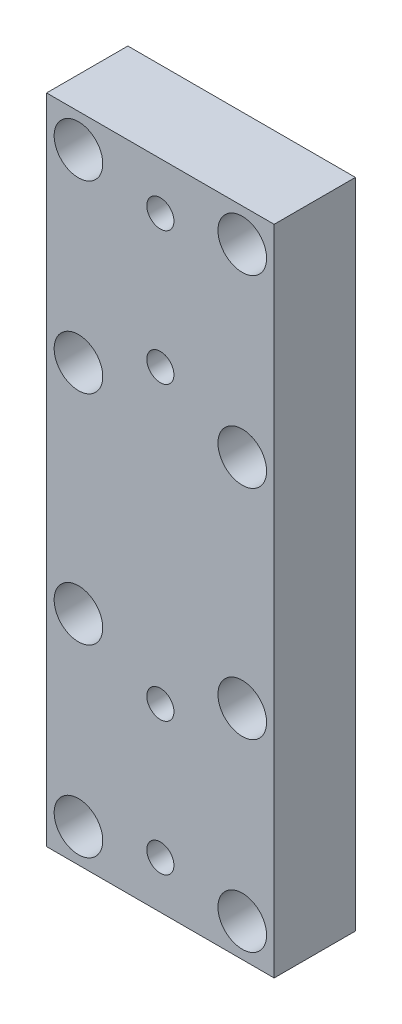
ISO-10303-21;
HEADER;
FILE_DESCRIPTION(('STEP AP214'),'2;1');
FILE_NAME('part.step','',(''),(''),'','','');
FILE_SCHEMA(('AUTOMOTIVE_DESIGN { 1 0 10303 214 1 1 1 1 }'));
ENDSEC;
DATA;
#1=APPLICATION_CONTEXT('core data for automotive mechanical design processes');
#2=APPLICATION_PROTOCOL_DEFINITION('international standard','automotive_design',2000,#1);
#3=PRODUCT_CONTEXT('',#1,'mechanical');
#4=PRODUCT('Part','Part','',(#3));
#5=PRODUCT_RELATED_PRODUCT_CATEGORY('part','',(#4));
#6=PRODUCT_DEFINITION_FORMATION('','',#4);
#7=PRODUCT_DEFINITION_CONTEXT('part definition',#1,'design');
#8=PRODUCT_DEFINITION('design','',#6,#7);
#9=PRODUCT_DEFINITION_SHAPE('','',#8);
#10=(LENGTH_UNIT() NAMED_UNIT(*) SI_UNIT(.MILLI.,.METRE.));
#11=(NAMED_UNIT(*) PLANE_ANGLE_UNIT() SI_UNIT($,.RADIAN.));
#12=(NAMED_UNIT(*) SI_UNIT($,.STERADIAN.) SOLID_ANGLE_UNIT());
#13=UNCERTAINTY_MEASURE_WITH_UNIT(LENGTH_MEASURE(1.E-05),#10,'distance_accuracy_value','');
#14=(GEOMETRIC_REPRESENTATION_CONTEXT(3) GLOBAL_UNCERTAINTY_ASSIGNED_CONTEXT((#13)) GLOBAL_UNIT_ASSIGNED_CONTEXT((#10,
#11,#12)) REPRESENTATION_CONTEXT('',''));
#15=CARTESIAN_POINT('',(0.,0.,0.));
#16=DIRECTION('',(0.,0.,1.));
#17=DIRECTION('',(1.,0.,0.));
#18=AXIS2_PLACEMENT_3D('',#15,#16,#17);
#19=CARTESIAN_POINT('',(-171.45,15.2380193466019,15.875000000003));
#20=DIRECTION('',(0.,0.,-1.));
#21=DIRECTION('',(0.,1.,0.));
#22=AXIS2_PLACEMENT_3D('',#19,#20,#21);
#23=CYLINDRICAL_SURFACE('',#22,2.65000000000001);
#24=CARTESIAN_POINT('',(-171.45,15.2380193466019,15.875000000003));
#25=DIRECTION('',(0.,0.,1.));
#26=DIRECTION('',(-1.,0.,0.));
#27=AXIS2_PLACEMENT_3D('',#24,#25,#26);
#28=CIRCLE('',#27,2.65000000000001);
#29=CARTESIAN_POINT('',(-174.1,15.2380193466019,15.875000000003));
#30=VERTEX_POINT('',#29);
#31=EDGE_CURVE('E50',#30,#30,#28,.T.);
#32=ORIENTED_EDGE('',*,*,#31,.T.);
#33=EDGE_LOOP('',(#32));
#34=FACE_BOUND('',#33,.T.);
#35=CARTESIAN_POINT('',(-171.45,15.2380193466019,6.34999999999992));
#36=DIRECTION('',(0.,0.,1.));
#37=DIRECTION('',(-1.,0.,0.));
#38=AXIS2_PLACEMENT_3D('',#35,#36,#37);
#39=CIRCLE('',#38,2.65000000000001);
#40=CARTESIAN_POINT('',(-174.1,15.2380193466019,6.34999999999992));
#41=VERTEX_POINT('',#40);
#42=EDGE_CURVE('E406',#41,#41,#39,.T.);
#43=ORIENTED_EDGE('',*,*,#42,.F.);
#44=EDGE_LOOP('',(#43));
#45=FACE_BOUND('',#44,.T.);
#46=ADVANCED_FACE('F41',(#34,#45),#23,.F.);
#47=CARTESIAN_POINT('',(-171.45,-10.7547806533981,15.8750000000031));
#48=DIRECTION('',(0.,0.,-1.));
#49=DIRECTION('',(0.,1.,0.));
#50=AXIS2_PLACEMENT_3D('',#47,#48,#49);
#51=CYLINDRICAL_SURFACE('',#50,2.65000000000001);
#52=CARTESIAN_POINT('',(-171.45,-10.7547806533981,15.8750000000031));
#53=DIRECTION('',(0.,0.,1.));
#54=DIRECTION('',(-1.,0.,0.));
#55=AXIS2_PLACEMENT_3D('',#52,#53,#54);
#56=CIRCLE('',#55,2.65000000000001);
#57=CARTESIAN_POINT('',(-174.1,-10.7547806533981,15.8750000000031));
#58=VERTEX_POINT('',#57);
#59=EDGE_CURVE('E11',#58,#58,#56,.T.);
#60=ORIENTED_EDGE('',*,*,#59,.T.);
#61=EDGE_LOOP('',(#60));
#62=FACE_BOUND('',#61,.T.);
#63=CARTESIAN_POINT('',(-171.45,-10.7547806533982,6.34999999999996));
#64=DIRECTION('',(0.,0.,1.));
#65=DIRECTION('',(-1.,0.,0.));
#66=AXIS2_PLACEMENT_3D('',#63,#64,#65);
#67=CIRCLE('',#66,2.65000000000001);
#68=CARTESIAN_POINT('',(-174.1,-10.7547806533982,6.34999999999996));
#69=VERTEX_POINT('',#68);
#70=EDGE_CURVE('E415',#69,#69,#67,.T.);
#71=ORIENTED_EDGE('',*,*,#70,.F.);
#72=EDGE_LOOP('',(#71));
#73=FACE_BOUND('',#72,.T.);
#74=ADVANCED_FACE('F271',(#62,#73),#51,.F.);
#75=CARTESIAN_POINT('',(-171.45,-93.7380193466019,53.975));
#76=DIRECTION('',(0.,0.,-1.));
#77=DIRECTION('',(-1.,0.,0.));
#78=AXIS2_PLACEMENT_3D('',#75,#76,#77);
#79=CYLINDRICAL_SURFACE('',#78,2.65000000000001);
#80=CARTESIAN_POINT('',(-171.45,-93.7380193466019,15.875000000003));
#81=DIRECTION('',(0.,0.,-1.));
#82=DIRECTION('',(-1.,0.,0.));
#83=AXIS2_PLACEMENT_3D('',#80,#81,#82);
#84=CIRCLE('',#83,2.65000000000001);
#85=CARTESIAN_POINT('',(-174.1,-93.7380193466019,15.875000000003));
#86=VERTEX_POINT('',#85);
#87=EDGE_CURVE('E167',#86,#86,#84,.T.);
#88=ORIENTED_EDGE('',*,*,#87,.F.);
#89=EDGE_LOOP('',(#88));
#90=FACE_BOUND('',#89,.T.);
#91=CARTESIAN_POINT('',(-171.45,-93.7380193466019,6.35));
#92=DIRECTION('',(0.,0.,-1.));
#93=DIRECTION('',(-1.,0.,0.));
#94=AXIS2_PLACEMENT_3D('',#91,#92,#93);
#95=CIRCLE('',#94,2.65000000000001);
#96=CARTESIAN_POINT('',(-174.1,-93.7380193466019,6.35));
#97=VERTEX_POINT('',#96);
#98=EDGE_CURVE('E199',#97,#97,#95,.T.);
#99=ORIENTED_EDGE('',*,*,#98,.T.);
#100=EDGE_LOOP('',(#99));
#101=FACE_BOUND('',#100,.T.);
#102=ADVANCED_FACE('F277',(#90,#101),#79,.F.);
#103=CARTESIAN_POINT('',(-171.45,-67.7452193466019,53.975));
#104=DIRECTION('',(0.,0.,-1.));
#105=DIRECTION('',(-1.,0.,0.));
#106=AXIS2_PLACEMENT_3D('',#103,#104,#105);
#107=CYLINDRICAL_SURFACE('',#106,2.65000000000001);
#108=CARTESIAN_POINT('',(-171.45,-67.7452193466019,15.875000000003));
#109=DIRECTION('',(0.,0.,-1.));
#110=DIRECTION('',(-1.,0.,0.));
#111=AXIS2_PLACEMENT_3D('',#108,#109,#110);
#112=CIRCLE('',#111,2.65000000000001);
#113=CARTESIAN_POINT('',(-174.1,-67.7452193466019,15.875000000003));
#114=VERTEX_POINT('',#113);
#115=EDGE_CURVE('E222',#114,#114,#112,.T.);
#116=ORIENTED_EDGE('',*,*,#115,.F.);
#117=EDGE_LOOP('',(#116));
#118=FACE_BOUND('',#117,.T.);
#119=CARTESIAN_POINT('',(-171.45,-67.7452193466019,6.35));
#120=DIRECTION('',(0.,0.,-1.));
#121=DIRECTION('',(-1.,0.,0.));
#122=AXIS2_PLACEMENT_3D('',#119,#120,#121);
#123=CIRCLE('',#122,2.65000000000001);
#124=CARTESIAN_POINT('',(-174.1,-67.7452193466019,6.35));
#125=VERTEX_POINT('',#124);
#126=EDGE_CURVE('E175',#125,#125,#123,.T.);
#127=ORIENTED_EDGE('',*,*,#126,.T.);
#128=EDGE_LOOP('',(#127));
#129=FACE_BOUND('',#128,.T.);
#130=ADVANCED_FACE('F268',(#118,#129),#107,.F.);
#131=CARTESIAN_POINT('',(0.,0.,6.35));
#132=DIRECTION('',(0.,0.,1.));
#133=DIRECTION('',(1.,0.,0.));
#134=AXIS2_PLACEMENT_3D('',#131,#132,#133);
#135=PLANE('',#134);
#136=CARTESIAN_POINT('',(-155.45,-96.5,6.35));
#137=DIRECTION('',(0.,0.,1.));
#138=DIRECTION('',(1.,0.,0.));
#139=AXIS2_PLACEMENT_3D('',#136,#137,#138);
#140=CIRCLE('',#139,2.64999999999999);
#141=CARTESIAN_POINT('',(-152.8,-96.5,6.35));
#142=VERTEX_POINT('',#141);
#143=EDGE_CURVE('E110',#142,#142,#140,.T.);
#144=ORIENTED_EDGE('',*,*,#143,.F.);
#145=EDGE_LOOP('',(#144));
#146=FACE_BOUND('',#145,.T.);
#147=CARTESIAN_POINT('',(-155.45,-96.5,6.35));
#148=DIRECTION('',(0.,0.,1.));
#149=DIRECTION('',(1.,0.,0.));
#150=AXIS2_PLACEMENT_3D('',#147,#148,#149);
#151=CIRCLE('',#150,4.75000000000001);
#152=CARTESIAN_POINT('',(-150.7,-96.5,6.35));
#153=VERTEX_POINT('',#152);
#154=EDGE_CURVE('E171',#153,#153,#151,.T.);
#155=ORIENTED_EDGE('',*,*,#154,.T.);
#156=EDGE_LOOP('',(#155));
#157=FACE_BOUND('',#156,.T.);
#158=ADVANCED_FACE('F254',(#146,#157),#135,.T.);
#159=CARTESIAN_POINT('',(-155.45,-60.5,6.35));
#160=DIRECTION('',(0.,0.,1.));
#161=DIRECTION('',(1.,0.,0.));
#162=AXIS2_PLACEMENT_3D('',#159,#160,#161);
#163=CIRCLE('',#162,2.65000000000002);
#164=CARTESIAN_POINT('',(-152.8,-60.5,6.35));
#165=VERTEX_POINT('',#164);
#166=EDGE_CURVE('E117',#165,#165,#163,.T.);
#167=ORIENTED_EDGE('',*,*,#166,.F.);
#168=EDGE_LOOP('',(#167));
#169=FACE_BOUND('',#168,.T.);
#170=CARTESIAN_POINT('',(-155.45,-60.5,6.35));
#171=DIRECTION('',(0.,0.,1.));
#172=DIRECTION('',(1.,0.,0.));
#173=AXIS2_PLACEMENT_3D('',#170,#171,#172);
#174=CIRCLE('',#173,4.75000000000001);
#175=CARTESIAN_POINT('',(-150.7,-60.5,6.35));
#176=VERTEX_POINT('',#175);
#177=EDGE_CURVE('E174',#176,#176,#174,.T.);
#178=ORIENTED_EDGE('',*,*,#177,.T.);
#179=EDGE_LOOP('',(#178));
#180=FACE_BOUND('',#179,.T.);
#181=ADVANCED_FACE('F267',(#169,#180),#135,.T.);
#182=CARTESIAN_POINT('',(-187.45,-18.,6.35));
#183=DIRECTION('',(0.,0.,1.));
#184=DIRECTION('',(1.,0.,0.));
#185=AXIS2_PLACEMENT_3D('',#182,#183,#184);
#186=CIRCLE('',#185,2.64999999999999);
#187=CARTESIAN_POINT('',(-184.8,-18.,6.35));
#188=VERTEX_POINT('',#187);
#189=EDGE_CURVE('E123',#188,#188,#186,.T.);
#190=ORIENTED_EDGE('',*,*,#189,.F.);
#191=EDGE_LOOP('',(#190));
#192=FACE_BOUND('',#191,.T.);
#193=CARTESIAN_POINT('',(-187.45,-18.,6.35));
#194=DIRECTION('',(0.,0.,1.));
#195=DIRECTION('',(1.,0.,0.));
#196=AXIS2_PLACEMENT_3D('',#193,#194,#195);
#197=CIRCLE('',#196,4.75);
#198=CARTESIAN_POINT('',(-182.7,-18.,6.35));
#199=VERTEX_POINT('',#198);
#200=EDGE_CURVE('E181',#199,#199,#197,.T.);
#201=ORIENTED_EDGE('',*,*,#200,.T.);
#202=EDGE_LOOP('',(#201));
#203=FACE_BOUND('',#202,.T.);
#204=ADVANCED_FACE('F341',(#192,#203),#135,.T.);
#205=CARTESIAN_POINT('',(-155.45,18.,6.35));
#206=DIRECTION('',(0.,0.,1.));
#207=DIRECTION('',(1.,0.,0.));
#208=AXIS2_PLACEMENT_3D('',#205,#206,#207);
#209=CIRCLE('',#208,2.64999999999999);
#210=CARTESIAN_POINT('',(-152.8,18.,6.35));
#211=VERTEX_POINT('',#210);
#212=EDGE_CURVE('E129',#211,#211,#209,.T.);
#213=ORIENTED_EDGE('',*,*,#212,.F.);
#214=EDGE_LOOP('',(#213));
#215=FACE_BOUND('',#214,.T.);
#216=CARTESIAN_POINT('',(-155.45,18.,6.35));
#217=DIRECTION('',(0.,0.,1.));
#218=DIRECTION('',(1.,0.,0.));
#219=AXIS2_PLACEMENT_3D('',#216,#217,#218);
#220=CIRCLE('',#219,4.75);
#221=CARTESIAN_POINT('',(-150.7,18.,6.35));
#222=VERTEX_POINT('',#221);
#223=EDGE_CURVE('E187',#222,#222,#220,.T.);
#224=ORIENTED_EDGE('',*,*,#223,.T.);
#225=EDGE_LOOP('',(#224));
#226=FACE_BOUND('',#225,.T.);
#227=ADVANCED_FACE('F338',(#215,#226),#135,.T.);
#228=CARTESIAN_POINT('',(-187.45,18.,6.35));
#229=DIRECTION('',(0.,0.,1.));
#230=DIRECTION('',(1.,0.,0.));
#231=AXIS2_PLACEMENT_3D('',#228,#229,#230);
#232=CIRCLE('',#231,2.64999999999999);
#233=CARTESIAN_POINT('',(-184.8,18.,6.35));
#234=VERTEX_POINT('',#233);
#235=EDGE_CURVE('E126',#234,#234,#232,.T.);
#236=ORIENTED_EDGE('',*,*,#235,.F.);
#237=EDGE_LOOP('',(#236));
#238=FACE_BOUND('',#237,.T.);
#239=CARTESIAN_POINT('',(-187.45,18.,6.35));
#240=DIRECTION('',(0.,0.,1.));
#241=DIRECTION('',(1.,0.,0.));
#242=AXIS2_PLACEMENT_3D('',#239,#240,#241);
#243=CIRCLE('',#242,4.75);
#244=CARTESIAN_POINT('',(-182.7,18.,6.35));
#245=VERTEX_POINT('',#244);
#246=EDGE_CURVE('E184',#245,#245,#243,.T.);
#247=ORIENTED_EDGE('',*,*,#246,.T.);
#248=EDGE_LOOP('',(#247));
#249=FACE_BOUND('',#248,.T.);
#250=ADVANCED_FACE('F340',(#238,#249),#135,.T.);
#251=CARTESIAN_POINT('',(-155.45,-18.,6.35));
#252=DIRECTION('',(0.,0.,1.));
#253=DIRECTION('',(1.,0.,0.));
#254=AXIS2_PLACEMENT_3D('',#251,#252,#253);
#255=CIRCLE('',#254,2.64999999999999);
#256=CARTESIAN_POINT('',(-152.8,-18.,6.35));
#257=VERTEX_POINT('',#256);
#258=EDGE_CURVE('E120',#257,#257,#255,.T.);
#259=ORIENTED_EDGE('',*,*,#258,.F.);
#260=EDGE_LOOP('',(#259));
#261=FACE_BOUND('',#260,.T.);
#262=CARTESIAN_POINT('',(-155.45,-18.,6.35));
#263=DIRECTION('',(0.,0.,1.));
#264=DIRECTION('',(1.,0.,0.));
#265=AXIS2_PLACEMENT_3D('',#262,#263,#264);
#266=CIRCLE('',#265,4.75);
#267=CARTESIAN_POINT('',(-150.7,-18.,6.35));
#268=VERTEX_POINT('',#267);
#269=EDGE_CURVE('E178',#268,#268,#266,.T.);
#270=ORIENTED_EDGE('',*,*,#269,.T.);
#271=EDGE_LOOP('',(#270));
#272=FACE_BOUND('',#271,.T.);
#273=ADVANCED_FACE('F262',(#261,#272),#135,.T.);
#274=CARTESIAN_POINT('',(-187.45,-60.5,6.35));
#275=DIRECTION('',(0.,0.,1.));
#276=DIRECTION('',(1.,0.,0.));
#277=AXIS2_PLACEMENT_3D('',#274,#275,#276);
#278=CIRCLE('',#277,2.64999999999998);
#279=CARTESIAN_POINT('',(-184.8,-60.5,6.35));
#280=VERTEX_POINT('',#279);
#281=EDGE_CURVE('E113',#280,#280,#278,.T.);
#282=ORIENTED_EDGE('',*,*,#281,.F.);
#283=EDGE_LOOP('',(#282));
#284=FACE_BOUND('',#283,.T.);
#285=CARTESIAN_POINT('',(-187.45,-60.5,6.35));
#286=DIRECTION('',(0.,0.,1.));
#287=DIRECTION('',(1.,0.,0.));
#288=AXIS2_PLACEMENT_3D('',#285,#286,#287);
#289=CIRCLE('',#288,4.75000000000001);
#290=CARTESIAN_POINT('',(-182.7,-60.5,6.35));
#291=VERTEX_POINT('',#290);
#292=EDGE_CURVE('E170',#291,#291,#289,.T.);
#293=ORIENTED_EDGE('',*,*,#292,.T.);
#294=EDGE_LOOP('',(#293));
#295=FACE_BOUND('',#294,.T.);
#296=ADVANCED_FACE('F251',(#284,#295),#135,.T.);
#297=CARTESIAN_POINT('',(-187.45,-96.5,6.35));
#298=DIRECTION('',(0.,0.,1.));
#299=DIRECTION('',(1.,0.,0.));
#300=AXIS2_PLACEMENT_3D('',#297,#298,#299);
#301=CIRCLE('',#300,2.64999999999999);
#302=CARTESIAN_POINT('',(-184.8,-96.5,6.35));
#303=VERTEX_POINT('',#302);
#304=EDGE_CURVE('E95',#303,#303,#301,.T.);
#305=ORIENTED_EDGE('',*,*,#304,.F.);
#306=EDGE_LOOP('',(#305));
#307=FACE_BOUND('',#306,.T.);
#308=CARTESIAN_POINT('',(-187.45,-96.5,6.35));
#309=DIRECTION('',(0.,0.,1.));
#310=DIRECTION('',(1.,0.,0.));
#311=AXIS2_PLACEMENT_3D('',#308,#309,#310);
#312=CIRCLE('',#311,4.75000000000001);
#313=CARTESIAN_POINT('',(-182.7,-96.5,6.35));
#314=VERTEX_POINT('',#313);
#315=EDGE_CURVE('E165',#314,#314,#312,.T.);
#316=ORIENTED_EDGE('',*,*,#315,.T.);
#317=EDGE_LOOP('',(#316));
#318=FACE_BOUND('',#317,.T.);
#319=ADVANCED_FACE('F249',(#307,#318),#135,.T.);
#320=CARTESIAN_POINT('',(-149.225,0.,6.35));
#321=DIRECTION('',(1.,0.,0.));
#322=DIRECTION('',(0.,0.,-1.));
#323=AXIS2_PLACEMENT_3D('',#320,#321,#322);
#324=PLANE('',#323);
#325=DIRECTION('',(0.,-1.,0.));
#326=VECTOR('',#325,1.);
#327=CARTESIAN_POINT('',(-149.225,0.,0.));
#328=LINE('',#327,#326);
#329=CARTESIAN_POINT('',(-149.225,24.5,0.));
#330=VERTEX_POINT('',#329);
#331=CARTESIAN_POINT('',(-149.225,-103.,0.));
#332=VERTEX_POINT('',#331);
#333=EDGE_CURVE('E91',#330,#332,#328,.T.);
#334=ORIENTED_EDGE('',*,*,#333,.F.);
#335=DIRECTION('',(0.,0.,-1.));
#336=VECTOR('',#335,1.);
#337=CARTESIAN_POINT('',(-149.225,24.5,6.35));
#338=LINE('',#337,#336);
#339=CARTESIAN_POINT('',(-149.225,24.5,15.875000000003));
#340=VERTEX_POINT('',#339);
#341=EDGE_CURVE('E72',#340,#330,#338,.T.);
#342=ORIENTED_EDGE('',*,*,#341,.F.);
#343=DIRECTION('',(0.,-1.,0.));
#344=VECTOR('',#343,1.);
#345=CARTESIAN_POINT('',(-149.225,0.,15.875000000003));
#346=LINE('',#345,#344);
#347=CARTESIAN_POINT('',(-149.225,-103.,15.875000000003));
#348=VERTEX_POINT('',#347);
#349=EDGE_CURVE('E163',#340,#348,#346,.T.);
#350=ORIENTED_EDGE('',*,*,#349,.T.);
#351=DIRECTION('',(0.,0.,-1.));
#352=VECTOR('',#351,1.);
#353=CARTESIAN_POINT('',(-149.225,-103.,6.35));
#354=LINE('',#353,#352);
#355=EDGE_CURVE('E58',#348,#332,#354,.T.);
#356=ORIENTED_EDGE('',*,*,#355,.T.);
#357=EDGE_LOOP('',(#334,#342,#350,#356));
#358=FACE_BOUND('',#357,.T.);
#359=ADVANCED_FACE('F92',(#358),#324,.T.);
#360=CARTESIAN_POINT('',(0.,24.5,6.35));
#361=DIRECTION('',(0.,1.,0.));
#362=DIRECTION('',(0.,0.,1.));
#363=AXIS2_PLACEMENT_3D('',#360,#361,#362);
#364=PLANE('',#363);
#365=DIRECTION('',(1.,0.,0.));
#366=VECTOR('',#365,1.);
#367=CARTESIAN_POINT('',(0.,24.5,0.));
#368=LINE('',#367,#366);
#369=CARTESIAN_POINT('',(-193.675,24.5,0.));
#370=VERTEX_POINT('',#369);
#371=EDGE_CURVE('E85',#370,#330,#368,.T.);
#372=ORIENTED_EDGE('',*,*,#371,.F.);
#373=DIRECTION('',(0.,0.,-1.));
#374=VECTOR('',#373,1.);
#375=CARTESIAN_POINT('',(-193.675,24.5,6.35));
#376=LINE('',#375,#374);
#377=CARTESIAN_POINT('',(-193.675,24.5,15.875000000003));
#378=VERTEX_POINT('',#377);
#379=EDGE_CURVE('E114',#378,#370,#376,.T.);
#380=ORIENTED_EDGE('',*,*,#379,.F.);
#381=DIRECTION('',(1.,0.,0.));
#382=VECTOR('',#381,1.);
#383=CARTESIAN_POINT('',(0.,24.5,15.8750000000029));
#384=LINE('',#383,#382);
#385=EDGE_CURVE('E87',#378,#340,#384,.T.);
#386=ORIENTED_EDGE('',*,*,#385,.T.);
#387=ORIENTED_EDGE('',*,*,#341,.T.);
#388=EDGE_LOOP('',(#372,#380,#386,#387));
#389=FACE_BOUND('',#388,.T.);
#390=ADVANCED_FACE('F83',(#389),#364,.T.);
#391=CARTESIAN_POINT('',(-193.675,0.,6.35));
#392=DIRECTION('',(1.,0.,0.));
#393=DIRECTION('',(0.,0.,-1.));
#394=AXIS2_PLACEMENT_3D('',#391,#392,#393);
#395=PLANE('',#394);
#396=DIRECTION('',(0.,-1.,0.));
#397=VECTOR('',#396,1.);
#398=CARTESIAN_POINT('',(-193.675,0.,0.));
#399=LINE('',#398,#397);
#400=CARTESIAN_POINT('',(-193.675,-103.,0.));
#401=VERTEX_POINT('',#400);
#402=EDGE_CURVE('E88',#370,#401,#399,.T.);
#403=ORIENTED_EDGE('',*,*,#402,.T.);
#404=DIRECTION('',(0.,0.,-1.));
#405=VECTOR('',#404,1.);
#406=CARTESIAN_POINT('',(-193.675,-103.,6.35));
#407=LINE('',#406,#405);
#408=CARTESIAN_POINT('',(-193.675,-103.,15.875000000003));
#409=VERTEX_POINT('',#408);
#410=EDGE_CURVE('E109',#409,#401,#407,.T.);
#411=ORIENTED_EDGE('',*,*,#410,.F.);
#412=DIRECTION('',(0.,-1.,0.));
#413=VECTOR('',#412,1.);
#414=CARTESIAN_POINT('',(-193.675,0.,15.875000000003));
#415=LINE('',#414,#413);
#416=EDGE_CURVE('E158',#378,#409,#415,.T.);
#417=ORIENTED_EDGE('',*,*,#416,.F.);
#418=ORIENTED_EDGE('',*,*,#379,.T.);
#419=EDGE_LOOP('',(#403,#411,#417,#418));
#420=FACE_BOUND('',#419,.T.);
#421=ADVANCED_FACE('F455',(#420),#395,.F.);
#422=CARTESIAN_POINT('',(-155.45,-96.5,6.35));
#423=DIRECTION('',(0.,0.,-1.));
#424=DIRECTION('',(-1.,0.,0.));
#425=AXIS2_PLACEMENT_3D('',#422,#423,#424);
#426=CYLINDRICAL_SURFACE('',#425,2.64999999999999);
#427=ORIENTED_EDGE('',*,*,#143,.T.);
#428=EDGE_LOOP('',(#427));
#429=FACE_BOUND('',#428,.T.);
#430=CARTESIAN_POINT('',(-155.45,-96.5,0.));
#431=DIRECTION('',(0.,0.,1.));
#432=DIRECTION('',(1.,0.,0.));
#433=AXIS2_PLACEMENT_3D('',#430,#431,#432);
#434=CIRCLE('',#433,2.64999999999999);
#435=CARTESIAN_POINT('',(-152.8,-96.5,0.));
#436=VERTEX_POINT('',#435);
#437=EDGE_CURVE('E383',#436,#436,#434,.T.);
#438=ORIENTED_EDGE('',*,*,#437,.F.);
#439=EDGE_LOOP('',(#438));
#440=FACE_BOUND('',#439,.T.);
#441=ADVANCED_FACE('F458',(#429,#440),#426,.F.);
#442=CARTESIAN_POINT('',(-187.45,-60.5,6.35));
#443=DIRECTION('',(0.,0.,-1.));
#444=DIRECTION('',(-1.,0.,0.));
#445=AXIS2_PLACEMENT_3D('',#442,#443,#444);
#446=CYLINDRICAL_SURFACE('',#445,2.64999999999998);
#447=ORIENTED_EDGE('',*,*,#281,.T.);
#448=EDGE_LOOP('',(#447));
#449=FACE_BOUND('',#448,.T.);
#450=CARTESIAN_POINT('',(-187.45,-60.5,0.));
#451=DIRECTION('',(0.,0.,1.));
#452=DIRECTION('',(1.,0.,0.));
#453=AXIS2_PLACEMENT_3D('',#450,#451,#452);
#454=CIRCLE('',#453,2.64999999999998);
#455=CARTESIAN_POINT('',(-184.8,-60.5,0.));
#456=VERTEX_POINT('',#455);
#457=EDGE_CURVE('E379',#456,#456,#454,.T.);
#458=ORIENTED_EDGE('',*,*,#457,.F.);
#459=EDGE_LOOP('',(#458));
#460=FACE_BOUND('',#459,.T.);
#461=ADVANCED_FACE('F476',(#449,#460),#446,.F.);
#462=CARTESIAN_POINT('',(-155.45,-60.5,6.35));
#463=DIRECTION('',(0.,0.,-1.));
#464=DIRECTION('',(-1.,0.,0.));
#465=AXIS2_PLACEMENT_3D('',#462,#463,#464);
#466=CYLINDRICAL_SURFACE('',#465,2.65000000000002);
#467=ORIENTED_EDGE('',*,*,#166,.T.);
#468=EDGE_LOOP('',(#467));
#469=FACE_BOUND('',#468,.T.);
#470=CARTESIAN_POINT('',(-155.45,-60.5,0.));
#471=DIRECTION('',(0.,0.,1.));
#472=DIRECTION('',(1.,0.,0.));
#473=AXIS2_PLACEMENT_3D('',#470,#471,#472);
#474=CIRCLE('',#473,2.65000000000002);
#475=CARTESIAN_POINT('',(-152.8,-60.5,0.));
#476=VERTEX_POINT('',#475);
#477=EDGE_CURVE('E375',#476,#476,#474,.T.);
#478=ORIENTED_EDGE('',*,*,#477,.F.);
#479=EDGE_LOOP('',(#478));
#480=FACE_BOUND('',#479,.T.);
#481=ADVANCED_FACE('F472',(#469,#480),#466,.F.);
#482=CARTESIAN_POINT('',(-155.45,-18.,6.35));
#483=DIRECTION('',(0.,0.,-1.));
#484=DIRECTION('',(-1.,0.,0.));
#485=AXIS2_PLACEMENT_3D('',#482,#483,#484);
#486=CYLINDRICAL_SURFACE('',#485,2.64999999999999);
#487=ORIENTED_EDGE('',*,*,#258,.T.);
#488=EDGE_LOOP('',(#487));
#489=FACE_BOUND('',#488,.T.);
#490=CARTESIAN_POINT('',(-155.45,-18.,0.));
#491=DIRECTION('',(0.,0.,1.));
#492=DIRECTION('',(1.,0.,0.));
#493=AXIS2_PLACEMENT_3D('',#490,#491,#492);
#494=CIRCLE('',#493,2.64999999999999);
#495=CARTESIAN_POINT('',(-152.8,-18.,0.));
#496=VERTEX_POINT('',#495);
#497=EDGE_CURVE('E371',#496,#496,#494,.T.);
#498=ORIENTED_EDGE('',*,*,#497,.F.);
#499=EDGE_LOOP('',(#498));
#500=FACE_BOUND('',#499,.T.);
#501=ADVANCED_FACE('F468',(#489,#500),#486,.F.);
#502=CARTESIAN_POINT('',(-187.45,-18.,6.35));
#503=DIRECTION('',(0.,0.,-1.));
#504=DIRECTION('',(-1.,0.,0.));
#505=AXIS2_PLACEMENT_3D('',#502,#503,#504);
#506=CYLINDRICAL_SURFACE('',#505,2.64999999999999);
#507=ORIENTED_EDGE('',*,*,#189,.T.);
#508=EDGE_LOOP('',(#507));
#509=FACE_BOUND('',#508,.T.);
#510=CARTESIAN_POINT('',(-187.45,-18.,0.));
#511=DIRECTION('',(0.,0.,1.));
#512=DIRECTION('',(1.,0.,0.));
#513=AXIS2_PLACEMENT_3D('',#510,#511,#512);
#514=CIRCLE('',#513,2.64999999999999);
#515=CARTESIAN_POINT('',(-184.8,-18.,0.));
#516=VERTEX_POINT('',#515);
#517=EDGE_CURVE('E367',#516,#516,#514,.T.);
#518=ORIENTED_EDGE('',*,*,#517,.F.);
#519=EDGE_LOOP('',(#518));
#520=FACE_BOUND('',#519,.T.);
#521=ADVANCED_FACE('F464',(#509,#520),#506,.F.);
#522=CARTESIAN_POINT('',(-187.45,18.,6.35));
#523=DIRECTION('',(0.,0.,-1.));
#524=DIRECTION('',(-1.,0.,0.));
#525=AXIS2_PLACEMENT_3D('',#522,#523,#524);
#526=CYLINDRICAL_SURFACE('',#525,2.64999999999999);
#527=ORIENTED_EDGE('',*,*,#235,.T.);
#528=EDGE_LOOP('',(#527));
#529=FACE_BOUND('',#528,.T.);
#530=CARTESIAN_POINT('',(-187.45,18.,0.));
#531=DIRECTION('',(0.,0.,1.));
#532=DIRECTION('',(1.,0.,0.));
#533=AXIS2_PLACEMENT_3D('',#530,#531,#532);
#534=CIRCLE('',#533,2.64999999999999);
#535=CARTESIAN_POINT('',(-184.8,18.,0.));
#536=VERTEX_POINT('',#535);
#537=EDGE_CURVE('E102',#536,#536,#534,.T.);
#538=ORIENTED_EDGE('',*,*,#537,.F.);
#539=EDGE_LOOP('',(#538));
#540=FACE_BOUND('',#539,.T.);
#541=ADVANCED_FACE('F357',(#529,#540),#526,.F.);
#542=CARTESIAN_POINT('',(-155.45,18.,6.35));
#543=DIRECTION('',(0.,0.,-1.));
#544=DIRECTION('',(-1.,0.,0.));
#545=AXIS2_PLACEMENT_3D('',#542,#543,#544);
#546=CYLINDRICAL_SURFACE('',#545,2.64999999999999);
#547=ORIENTED_EDGE('',*,*,#212,.T.);
#548=EDGE_LOOP('',(#547));
#549=FACE_BOUND('',#548,.T.);
#550=CARTESIAN_POINT('',(-155.45,18.,0.));
#551=DIRECTION('',(0.,0.,1.));
#552=DIRECTION('',(1.,0.,0.));
#553=AXIS2_PLACEMENT_3D('',#550,#551,#552);
#554=CIRCLE('',#553,2.64999999999999);
#555=CARTESIAN_POINT('',(-152.8,18.,0.));
#556=VERTEX_POINT('',#555);
#557=EDGE_CURVE('E99',#556,#556,#554,.T.);
#558=ORIENTED_EDGE('',*,*,#557,.F.);
#559=EDGE_LOOP('',(#558));
#560=FACE_BOUND('',#559,.T.);
#561=ADVANCED_FACE('F353',(#549,#560),#546,.F.);
#562=CARTESIAN_POINT('',(0.,-103.,6.35));
#563=DIRECTION('',(0.,1.,0.));
#564=DIRECTION('',(0.,0.,1.));
#565=AXIS2_PLACEMENT_3D('',#562,#563,#564);
#566=PLANE('',#565);
#567=DIRECTION('',(1.,0.,0.));
#568=VECTOR('',#567,1.);
#569=CARTESIAN_POINT('',(0.,-103.,0.));
#570=LINE('',#569,#568);
#571=EDGE_CURVE('E132',#401,#332,#570,.T.);
#572=ORIENTED_EDGE('',*,*,#571,.T.);
#573=ORIENTED_EDGE('',*,*,#355,.F.);
#574=DIRECTION('',(1.,0.,0.));
#575=VECTOR('',#574,1.);
#576=CARTESIAN_POINT('',(0.,-103.,15.8750000000029));
#577=LINE('',#576,#575);
#578=EDGE_CURVE('E161',#409,#348,#577,.T.);
#579=ORIENTED_EDGE('',*,*,#578,.F.);
#580=ORIENTED_EDGE('',*,*,#410,.T.);
#581=EDGE_LOOP('',(#572,#573,#579,#580));
#582=FACE_BOUND('',#581,.T.);
#583=ADVANCED_FACE('F356',(#582),#566,.F.);
#584=CARTESIAN_POINT('',(-187.45,-96.5,6.35));
#585=DIRECTION('',(0.,0.,-1.));
#586=DIRECTION('',(-1.,0.,0.));
#587=AXIS2_PLACEMENT_3D('',#584,#585,#586);
#588=CYLINDRICAL_SURFACE('',#587,2.64999999999999);
#589=ORIENTED_EDGE('',*,*,#304,.T.);
#590=EDGE_LOOP('',(#589));
#591=FACE_BOUND('',#590,.T.);
#592=CARTESIAN_POINT('',(-187.45,-96.5,0.));
#593=DIRECTION('',(0.,0.,1.));
#594=DIRECTION('',(1.,0.,0.));
#595=AXIS2_PLACEMENT_3D('',#592,#593,#594);
#596=CIRCLE('',#595,2.64999999999999);
#597=CARTESIAN_POINT('',(-184.8,-96.5,0.));
#598=VERTEX_POINT('',#597);
#599=EDGE_CURVE('E386',#598,#598,#596,.T.);
#600=ORIENTED_EDGE('',*,*,#599,.F.);
#601=EDGE_LOOP('',(#600));
#602=FACE_BOUND('',#601,.T.);
#603=ADVANCED_FACE('F333',(#591,#602),#588,.F.);
#604=CARTESIAN_POINT('',(0.,0.,0.));
#605=DIRECTION('',(0.,0.,1.));
#606=DIRECTION('',(1.,0.,0.));
#607=AXIS2_PLACEMENT_3D('',#604,#605,#606);
#608=PLANE('',#607);
#609=CARTESIAN_POINT('',(-171.45,-10.7547806533982,0.));
#610=DIRECTION('',(0.,0.,1.));
#611=DIRECTION('',(-1.,0.,0.));
#612=AXIS2_PLACEMENT_3D('',#609,#610,#611);
#613=CIRCLE('',#612,4.75000000000001);
#614=CARTESIAN_POINT('',(-176.2,-10.7547806533982,0.));
#615=VERTEX_POINT('',#614);
#616=EDGE_CURVE('E410',#615,#615,#613,.T.);
#617=ORIENTED_EDGE('',*,*,#616,.T.);
#618=EDGE_LOOP('',(#617));
#619=FACE_BOUND('',#618,.T.);
#620=CARTESIAN_POINT('',(-171.45,15.2380193466018,0.));
#621=DIRECTION('',(0.,0.,1.));
#622=DIRECTION('',(-1.,0.,0.));
#623=AXIS2_PLACEMENT_3D('',#620,#621,#622);
#624=CIRCLE('',#623,4.75000000000001);
#625=CARTESIAN_POINT('',(-176.2,15.2380193466018,0.));
#626=VERTEX_POINT('',#625);
#627=EDGE_CURVE('E403',#626,#626,#624,.T.);
#628=ORIENTED_EDGE('',*,*,#627,.T.);
#629=EDGE_LOOP('',(#628));
#630=FACE_BOUND('',#629,.T.);
#631=CARTESIAN_POINT('',(-171.45,-67.7452193466019,0.));
#632=DIRECTION('',(0.,0.,-1.));
#633=DIRECTION('',(-1.,0.,0.));
#634=AXIS2_PLACEMENT_3D('',#631,#632,#633);
#635=CIRCLE('',#634,4.75000000000001);
#636=CARTESIAN_POINT('',(-176.2,-67.7452193466019,0.));
#637=VERTEX_POINT('',#636);
#638=EDGE_CURVE('E136',#637,#637,#635,.T.);
#639=ORIENTED_EDGE('',*,*,#638,.F.);
#640=EDGE_LOOP('',(#639));
#641=FACE_BOUND('',#640,.T.);
#642=CARTESIAN_POINT('',(-171.45,-93.7380193466019,0.));
#643=DIRECTION('',(0.,0.,-1.));
#644=DIRECTION('',(-1.,0.,0.));
#645=AXIS2_PLACEMENT_3D('',#642,#643,#644);
#646=CIRCLE('',#645,4.75000000000001);
#647=CARTESIAN_POINT('',(-176.2,-93.7380193466019,0.));
#648=VERTEX_POINT('',#647);
#649=EDGE_CURVE('E192',#648,#648,#646,.T.);
#650=ORIENTED_EDGE('',*,*,#649,.F.);
#651=EDGE_LOOP('',(#650));
#652=FACE_BOUND('',#651,.T.);
#653=ORIENTED_EDGE('',*,*,#333,.T.);
#654=ORIENTED_EDGE('',*,*,#571,.F.);
#655=ORIENTED_EDGE('',*,*,#402,.F.);
#656=ORIENTED_EDGE('',*,*,#371,.T.);
#657=EDGE_LOOP('',(#653,#654,#655,#656));
#658=FACE_BOUND('',#657,.T.);
#659=ORIENTED_EDGE('',*,*,#557,.T.);
#660=EDGE_LOOP('',(#659));
#661=FACE_BOUND('',#660,.T.);
#662=ORIENTED_EDGE('',*,*,#537,.T.);
#663=EDGE_LOOP('',(#662));
#664=FACE_BOUND('',#663,.T.);
#665=ORIENTED_EDGE('',*,*,#517,.T.);
#666=EDGE_LOOP('',(#665));
#667=FACE_BOUND('',#666,.T.);
#668=ORIENTED_EDGE('',*,*,#497,.T.);
#669=EDGE_LOOP('',(#668));
#670=FACE_BOUND('',#669,.T.);
#671=ORIENTED_EDGE('',*,*,#477,.T.);
#672=EDGE_LOOP('',(#671));
#673=FACE_BOUND('',#672,.T.);
#674=ORIENTED_EDGE('',*,*,#457,.T.);
#675=EDGE_LOOP('',(#674));
#676=FACE_BOUND('',#675,.T.);
#677=ORIENTED_EDGE('',*,*,#437,.T.);
#678=EDGE_LOOP('',(#677));
#679=FACE_BOUND('',#678,.T.);
#680=ORIENTED_EDGE('',*,*,#599,.T.);
#681=EDGE_LOOP('',(#680));
#682=FACE_BOUND('',#681,.T.);
#683=ADVANCED_FACE('F43',(#619,#630,#641,#652,#658,#661,#664,#667,#670,#673,#676,#679,#682),
#608,.F.);
#684=CARTESIAN_POINT('',(-155.45,18.,150.901117843922));
#685=DIRECTION('',(0.,0.,-1.));
#686=DIRECTION('',(-1.,0.,0.));
#687=AXIS2_PLACEMENT_3D('',#684,#685,#686);
#688=CYLINDRICAL_SURFACE('',#687,4.75);
#689=CARTESIAN_POINT('',(-155.45,18.,15.875000000003));
#690=DIRECTION('',(0.,0.,-1.));
#691=DIRECTION('',(-1.,0.,0.));
#692=AXIS2_PLACEMENT_3D('',#689,#690,#691);
#693=CIRCLE('',#692,4.75);
#694=CARTESIAN_POINT('',(-160.2,18.,15.875000000003));
#695=VERTEX_POINT('',#694);
#696=EDGE_CURVE('E155',#695,#695,#693,.T.);
#697=ORIENTED_EDGE('',*,*,#696,.F.);
#698=EDGE_LOOP('',(#697));
#699=FACE_BOUND('',#698,.T.);
#700=ORIENTED_EDGE('',*,*,#223,.F.);
#701=EDGE_LOOP('',(#700));
#702=FACE_BOUND('',#701,.T.);
#703=ADVANCED_FACE('F325',(#699,#702),#688,.F.);
#704=CARTESIAN_POINT('',(-187.45,18.,150.901117843922));
#705=DIRECTION('',(0.,0.,-1.));
#706=DIRECTION('',(-1.,0.,0.));
#707=AXIS2_PLACEMENT_3D('',#704,#705,#706);
#708=CYLINDRICAL_SURFACE('',#707,4.75);
#709=CARTESIAN_POINT('',(-187.45,18.,15.875000000003));
#710=DIRECTION('',(0.,0.,-1.));
#711=DIRECTION('',(-1.,0.,0.));
#712=AXIS2_PLACEMENT_3D('',#709,#710,#711);
#713=CIRCLE('',#712,4.75);
#714=CARTESIAN_POINT('',(-192.2,18.,15.875000000003));
#715=VERTEX_POINT('',#714);
#716=EDGE_CURVE('E152',#715,#715,#713,.T.);
#717=ORIENTED_EDGE('',*,*,#716,.F.);
#718=EDGE_LOOP('',(#717));
#719=FACE_BOUND('',#718,.T.);
#720=ORIENTED_EDGE('',*,*,#246,.F.);
#721=EDGE_LOOP('',(#720));
#722=FACE_BOUND('',#721,.T.);
#723=ADVANCED_FACE('F321',(#719,#722),#708,.F.);
#724=CARTESIAN_POINT('',(-187.45,-18.,150.901117843922));
#725=DIRECTION('',(0.,0.,-1.));
#726=DIRECTION('',(-1.,0.,0.));
#727=AXIS2_PLACEMENT_3D('',#724,#725,#726);
#728=CYLINDRICAL_SURFACE('',#727,4.75);
#729=CARTESIAN_POINT('',(-187.45,-18.,15.875000000003));
#730=DIRECTION('',(0.,0.,-1.));
#731=DIRECTION('',(-1.,0.,0.));
#732=AXIS2_PLACEMENT_3D('',#729,#730,#731);
#733=CIRCLE('',#732,4.75);
#734=CARTESIAN_POINT('',(-192.2,-18.,15.875000000003));
#735=VERTEX_POINT('',#734);
#736=EDGE_CURVE('E149',#735,#735,#733,.T.);
#737=ORIENTED_EDGE('',*,*,#736,.F.);
#738=EDGE_LOOP('',(#737));
#739=FACE_BOUND('',#738,.T.);
#740=ORIENTED_EDGE('',*,*,#200,.F.);
#741=EDGE_LOOP('',(#740));
#742=FACE_BOUND('',#741,.T.);
#743=ADVANCED_FACE('F317',(#739,#742),#728,.F.);
#744=CARTESIAN_POINT('',(-155.45,-18.,150.901117843922));
#745=DIRECTION('',(0.,0.,-1.));
#746=DIRECTION('',(-1.,0.,0.));
#747=AXIS2_PLACEMENT_3D('',#744,#745,#746);
#748=CYLINDRICAL_SURFACE('',#747,4.75);
#749=CARTESIAN_POINT('',(-155.45,-18.,15.875000000003));
#750=DIRECTION('',(0.,0.,-1.));
#751=DIRECTION('',(-1.,0.,0.));
#752=AXIS2_PLACEMENT_3D('',#749,#750,#751);
#753=CIRCLE('',#752,4.75);
#754=CARTESIAN_POINT('',(-160.2,-18.,15.875000000003));
#755=VERTEX_POINT('',#754);
#756=EDGE_CURVE('E146',#755,#755,#753,.T.);
#757=ORIENTED_EDGE('',*,*,#756,.F.);
#758=EDGE_LOOP('',(#757));
#759=FACE_BOUND('',#758,.T.);
#760=ORIENTED_EDGE('',*,*,#269,.F.);
#761=EDGE_LOOP('',(#760));
#762=FACE_BOUND('',#761,.T.);
#763=ADVANCED_FACE('F313',(#759,#762),#748,.F.);
#764=CARTESIAN_POINT('',(-155.45,-60.5,150.901117843922));
#765=DIRECTION('',(0.,0.,-1.));
#766=DIRECTION('',(-1.,0.,0.));
#767=AXIS2_PLACEMENT_3D('',#764,#765,#766);
#768=CYLINDRICAL_SURFACE('',#767,4.75000000000001);
#769=CARTESIAN_POINT('',(-155.45,-60.5,15.875000000003));
#770=DIRECTION('',(0.,0.,-1.));
#771=DIRECTION('',(-1.,0.,0.));
#772=AXIS2_PLACEMENT_3D('',#769,#770,#771);
#773=CIRCLE('',#772,4.75000000000001);
#774=CARTESIAN_POINT('',(-160.2,-60.5,15.875000000003));
#775=VERTEX_POINT('',#774);
#776=EDGE_CURVE('E143',#775,#775,#773,.T.);
#777=ORIENTED_EDGE('',*,*,#776,.F.);
#778=EDGE_LOOP('',(#777));
#779=FACE_BOUND('',#778,.T.);
#780=ORIENTED_EDGE('',*,*,#177,.F.);
#781=EDGE_LOOP('',(#780));
#782=FACE_BOUND('',#781,.T.);
#783=ADVANCED_FACE('F309',(#779,#782),#768,.F.);
#784=CARTESIAN_POINT('',(-187.45,-60.5,150.901117843922));
#785=DIRECTION('',(0.,0.,-1.));
#786=DIRECTION('',(-1.,0.,0.));
#787=AXIS2_PLACEMENT_3D('',#784,#785,#786);
#788=CYLINDRICAL_SURFACE('',#787,4.75000000000001);
#789=CARTESIAN_POINT('',(-187.45,-60.5,15.875000000003));
#790=DIRECTION('',(0.,0.,-1.));
#791=DIRECTION('',(-1.,0.,0.));
#792=AXIS2_PLACEMENT_3D('',#789,#790,#791);
#793=CIRCLE('',#792,4.75000000000001);
#794=CARTESIAN_POINT('',(-192.2,-60.5,15.875000000003));
#795=VERTEX_POINT('',#794);
#796=EDGE_CURVE('E140',#795,#795,#793,.T.);
#797=ORIENTED_EDGE('',*,*,#796,.F.);
#798=EDGE_LOOP('',(#797));
#799=FACE_BOUND('',#798,.T.);
#800=ORIENTED_EDGE('',*,*,#292,.F.);
#801=EDGE_LOOP('',(#800));
#802=FACE_BOUND('',#801,.T.);
#803=ADVANCED_FACE('F305',(#799,#802),#788,.F.);
#804=CARTESIAN_POINT('',(-155.45,-96.5,150.901117843922));
#805=DIRECTION('',(0.,0.,-1.));
#806=DIRECTION('',(-1.,0.,0.));
#807=AXIS2_PLACEMENT_3D('',#804,#805,#806);
#808=CYLINDRICAL_SURFACE('',#807,4.75000000000001);
#809=CARTESIAN_POINT('',(-155.45,-96.5,15.875000000003));
#810=DIRECTION('',(0.,0.,-1.));
#811=DIRECTION('',(-1.,0.,0.));
#812=AXIS2_PLACEMENT_3D('',#809,#810,#811);
#813=CIRCLE('',#812,4.75000000000001);
#814=CARTESIAN_POINT('',(-160.2,-96.5,15.875000000003));
#815=VERTEX_POINT('',#814);
#816=EDGE_CURVE('E137',#815,#815,#813,.T.);
#817=ORIENTED_EDGE('',*,*,#816,.F.);
#818=EDGE_LOOP('',(#817));
#819=FACE_BOUND('',#818,.T.);
#820=ORIENTED_EDGE('',*,*,#154,.F.);
#821=EDGE_LOOP('',(#820));
#822=FACE_BOUND('',#821,.T.);
#823=ADVANCED_FACE('F245',(#819,#822),#808,.F.);
#824=CARTESIAN_POINT('',(-187.45,-96.5,150.901117843922));
#825=DIRECTION('',(0.,0.,-1.));
#826=DIRECTION('',(-1.,0.,0.));
#827=AXIS2_PLACEMENT_3D('',#824,#825,#826);
#828=CYLINDRICAL_SURFACE('',#827,4.75000000000001);
#829=CARTESIAN_POINT('',(-187.45,-96.5,15.875000000003));
#830=DIRECTION('',(0.,0.,-1.));
#831=DIRECTION('',(-1.,0.,0.));
#832=AXIS2_PLACEMENT_3D('',#829,#830,#831);
#833=CIRCLE('',#832,4.75000000000001);
#834=CARTESIAN_POINT('',(-192.2,-96.5,15.875000000003));
#835=VERTEX_POINT('',#834);
#836=EDGE_CURVE('E133',#835,#835,#833,.T.);
#837=ORIENTED_EDGE('',*,*,#836,.F.);
#838=EDGE_LOOP('',(#837));
#839=FACE_BOUND('',#838,.T.);
#840=ORIENTED_EDGE('',*,*,#315,.F.);
#841=EDGE_LOOP('',(#840));
#842=FACE_BOUND('',#841,.T.);
#843=ADVANCED_FACE('F217',(#839,#842),#828,.F.);
#844=CARTESIAN_POINT('',(-155.574999999998,-55.125,15.875000000003));
#845=DIRECTION('',(0.,0.,-1.));
#846=DIRECTION('',(-1.,0.,0.));
#847=AXIS2_PLACEMENT_3D('',#844,#845,#846);
#848=PLANE('',#847);
#849=ORIENTED_EDGE('',*,*,#59,.F.);
#850=EDGE_LOOP('',(#849));
#851=FACE_BOUND('',#850,.T.);
#852=ORIENTED_EDGE('',*,*,#31,.F.);
#853=EDGE_LOOP('',(#852));
#854=FACE_BOUND('',#853,.T.);
#855=ORIENTED_EDGE('',*,*,#115,.T.);
#856=EDGE_LOOP('',(#855));
#857=FACE_BOUND('',#856,.T.);
#858=ORIENTED_EDGE('',*,*,#87,.T.);
#859=EDGE_LOOP('',(#858));
#860=FACE_BOUND('',#859,.T.);
#861=ORIENTED_EDGE('',*,*,#578,.T.);
#862=ORIENTED_EDGE('',*,*,#349,.F.);
#863=ORIENTED_EDGE('',*,*,#385,.F.);
#864=ORIENTED_EDGE('',*,*,#416,.T.);
#865=EDGE_LOOP('',(#861,#862,#863,#864));
#866=FACE_BOUND('',#865,.T.);
#867=ORIENTED_EDGE('',*,*,#696,.T.);
#868=EDGE_LOOP('',(#867));
#869=FACE_BOUND('',#868,.T.);
#870=ORIENTED_EDGE('',*,*,#716,.T.);
#871=EDGE_LOOP('',(#870));
#872=FACE_BOUND('',#871,.T.);
#873=ORIENTED_EDGE('',*,*,#736,.T.);
#874=EDGE_LOOP('',(#873));
#875=FACE_BOUND('',#874,.T.);
#876=ORIENTED_EDGE('',*,*,#756,.T.);
#877=EDGE_LOOP('',(#876));
#878=FACE_BOUND('',#877,.T.);
#879=ORIENTED_EDGE('',*,*,#776,.T.);
#880=EDGE_LOOP('',(#879));
#881=FACE_BOUND('',#880,.T.);
#882=ORIENTED_EDGE('',*,*,#796,.T.);
#883=EDGE_LOOP('',(#882));
#884=FACE_BOUND('',#883,.T.);
#885=ORIENTED_EDGE('',*,*,#816,.T.);
#886=EDGE_LOOP('',(#885));
#887=FACE_BOUND('',#886,.T.);
#888=ORIENTED_EDGE('',*,*,#836,.T.);
#889=EDGE_LOOP('',(#888));
#890=FACE_BOUND('',#889,.T.);
#891=ADVANCED_FACE('F213',(#851,#854,#857,#860,#866,#869,#872,#875,#878,#881,#884,#887,#890),
#848,.F.);
#892=CARTESIAN_POINT('',(-171.45,-67.7452193466019,6.35));
#893=DIRECTION('',(0.,0.,-1.));
#894=DIRECTION('',(-1.,0.,0.));
#895=AXIS2_PLACEMENT_3D('',#892,#893,#894);
#896=CYLINDRICAL_SURFACE('',#895,4.75000000000001);
#897=CARTESIAN_POINT('',(-171.45,-67.7452193466019,6.35));
#898=DIRECTION('',(0.,0.,-1.));
#899=DIRECTION('',(-1.,0.,0.));
#900=AXIS2_PLACEMENT_3D('',#897,#898,#899);
#901=CIRCLE('',#900,4.75000000000001);
#902=CARTESIAN_POINT('',(-176.2,-67.7452193466019,6.35));
#903=VERTEX_POINT('',#902);
#904=EDGE_CURVE('E196',#903,#903,#901,.T.);
#905=ORIENTED_EDGE('',*,*,#904,.F.);
#906=EDGE_LOOP('',(#905));
#907=FACE_BOUND('',#906,.T.);
#908=ORIENTED_EDGE('',*,*,#638,.T.);
#909=EDGE_LOOP('',(#908));
#910=FACE_BOUND('',#909,.T.);
#911=ADVANCED_FACE('F216',(#907,#910),#896,.F.);
#912=CARTESIAN_POINT('',(0.,0.,6.35));
#913=DIRECTION('',(0.,0.,-1.));
#914=DIRECTION('',(-1.,0.,0.));
#915=AXIS2_PLACEMENT_3D('',#912,#913,#914);
#916=PLANE('',#915);
#917=ORIENTED_EDGE('',*,*,#126,.F.);
#918=EDGE_LOOP('',(#917));
#919=FACE_BOUND('',#918,.T.);
#920=ORIENTED_EDGE('',*,*,#904,.T.);
#921=EDGE_LOOP('',(#920));
#922=FACE_BOUND('',#921,.T.);
#923=ADVANCED_FACE('F281',(#919,#922),#916,.T.);
#924=CARTESIAN_POINT('',(-171.45,-93.7380193466019,6.35));
#925=DIRECTION('',(0.,0.,-1.));
#926=DIRECTION('',(-1.,0.,0.));
#927=AXIS2_PLACEMENT_3D('',#924,#925,#926);
#928=CYLINDRICAL_SURFACE('',#927,4.75000000000001);
#929=CARTESIAN_POINT('',(-171.45,-93.7380193466019,6.35));
#930=DIRECTION('',(0.,0.,-1.));
#931=DIRECTION('',(-1.,0.,0.));
#932=AXIS2_PLACEMENT_3D('',#929,#930,#931);
#933=CIRCLE('',#932,4.75000000000001);
#934=CARTESIAN_POINT('',(-176.2,-93.7380193466019,6.35));
#935=VERTEX_POINT('',#934);
#936=EDGE_CURVE('E195',#935,#935,#933,.T.);
#937=ORIENTED_EDGE('',*,*,#936,.F.);
#938=EDGE_LOOP('',(#937));
#939=FACE_BOUND('',#938,.T.);
#940=ORIENTED_EDGE('',*,*,#649,.T.);
#941=EDGE_LOOP('',(#940));
#942=FACE_BOUND('',#941,.T.);
#943=ADVANCED_FACE('F284',(#939,#942),#928,.F.);
#944=CARTESIAN_POINT('',(0.,0.,6.35));
#945=DIRECTION('',(0.,0.,-1.));
#946=DIRECTION('',(-1.,0.,0.));
#947=AXIS2_PLACEMENT_3D('',#944,#945,#946);
#948=PLANE('',#947);
#949=ORIENTED_EDGE('',*,*,#98,.F.);
#950=EDGE_LOOP('',(#949));
#951=FACE_BOUND('',#950,.T.);
#952=ORIENTED_EDGE('',*,*,#936,.T.);
#953=EDGE_LOOP('',(#952));
#954=FACE_BOUND('',#953,.T.);
#955=ADVANCED_FACE('F289',(#951,#954),#948,.T.);
#956=CARTESIAN_POINT('',(-171.45,-10.7547806533982,6.34999999999996));
#957=DIRECTION('',(0.,0.,-1.));
#958=DIRECTION('',(0.,1.,0.));
#959=AXIS2_PLACEMENT_3D('',#956,#957,#958);
#960=CYLINDRICAL_SURFACE('',#959,4.75000000000001);
#961=CARTESIAN_POINT('',(-171.45,-10.7547806533982,6.34999999999996));
#962=DIRECTION('',(0.,0.,1.));
#963=DIRECTION('',(-1.,0.,0.));
#964=AXIS2_PLACEMENT_3D('',#961,#962,#963);
#965=CIRCLE('',#964,4.75000000000001);
#966=CARTESIAN_POINT('',(-176.2,-10.7547806533982,6.34999999999996));
#967=VERTEX_POINT('',#966);
#968=EDGE_CURVE('E202',#967,#967,#965,.T.);
#969=ORIENTED_EDGE('',*,*,#968,.T.);
#970=EDGE_LOOP('',(#969));
#971=FACE_BOUND('',#970,.T.);
#972=ORIENTED_EDGE('',*,*,#616,.F.);
#973=EDGE_LOOP('',(#972));
#974=FACE_BOUND('',#973,.T.);
#975=ADVANCED_FACE('F292',(#971,#974),#960,.F.);
#976=CARTESIAN_POINT('',(0.,-78.5000000000001,6.35000000000005));
#977=DIRECTION('',(0.,0.,-1.));
#978=DIRECTION('',(-1.,0.,0.));
#979=AXIS2_PLACEMENT_3D('',#976,#977,#978);
#980=PLANE('',#979);
#981=ORIENTED_EDGE('',*,*,#70,.T.);
#982=EDGE_LOOP('',(#981));
#983=FACE_BOUND('',#982,.T.);
#984=ORIENTED_EDGE('',*,*,#968,.F.);
#985=EDGE_LOOP('',(#984));
#986=FACE_BOUND('',#985,.T.);
#987=ADVANCED_FACE('F421',(#983,#986),#980,.T.);
#988=CARTESIAN_POINT('',(-171.45,15.2380193466019,6.34999999999992));
#989=DIRECTION('',(0.,0.,-1.));
#990=DIRECTION('',(0.,1.,0.));
#991=AXIS2_PLACEMENT_3D('',#988,#989,#990);
#992=CYLINDRICAL_SURFACE('',#991,4.75000000000001);
#993=CARTESIAN_POINT('',(-171.45,15.2380193466019,6.34999999999992));
#994=DIRECTION('',(0.,0.,1.));
#995=DIRECTION('',(-1.,0.,0.));
#996=AXIS2_PLACEMENT_3D('',#993,#994,#995);
#997=CIRCLE('',#996,4.75000000000001);
#998=CARTESIAN_POINT('',(-176.2,15.2380193466019,6.34999999999992));
#999=VERTEX_POINT('',#998);
#1000=EDGE_CURVE('E407',#999,#999,#997,.T.);
#1001=ORIENTED_EDGE('',*,*,#1000,.T.);
#1002=EDGE_LOOP('',(#1001));
#1003=FACE_BOUND('',#1002,.T.);
#1004=ORIENTED_EDGE('',*,*,#627,.F.);
#1005=EDGE_LOOP('',(#1004));
#1006=FACE_BOUND('',#1005,.T.);
#1007=ADVANCED_FACE('F425',(#1003,#1006),#992,.F.);
#1008=CARTESIAN_POINT('',(0.,-78.5000000000001,6.35000000000005));
#1009=DIRECTION('',(0.,0.,-1.));
#1010=DIRECTION('',(-1.,0.,0.));
#1011=AXIS2_PLACEMENT_3D('',#1008,#1009,#1010);
#1012=PLANE('',#1011);
#1013=ORIENTED_EDGE('',*,*,#42,.T.);
#1014=EDGE_LOOP('',(#1013));
#1015=FACE_BOUND('',#1014,.T.);
#1016=ORIENTED_EDGE('',*,*,#1000,.F.);
#1017=EDGE_LOOP('',(#1016));
#1018=FACE_BOUND('',#1017,.T.);
#1019=ADVANCED_FACE('F443',(#1015,#1018),#1012,.T.);
#1020=CLOSED_SHELL('',(#46,#74,#102,#130,#158,#181,#204,#227,#250,#273,#296,#319,#359,#390,#421,
#441,#461,#481,#501,#521,#541,#561,#583,#603,#683,#703,#723,#743,#763,#783,#803,#823,#843,#891,
#911,#923,#943,#955,#975,#987,#1007,#1019));
#1021=MANIFOLD_SOLID_BREP('B2',#1020);
#1022=ADVANCED_BREP_SHAPE_REPRESENTATION('',(#18,#1021),#14);
#1023=SHAPE_DEFINITION_REPRESENTATION(#9,#1022);
ENDSEC;
END-ISO-10303-21;
